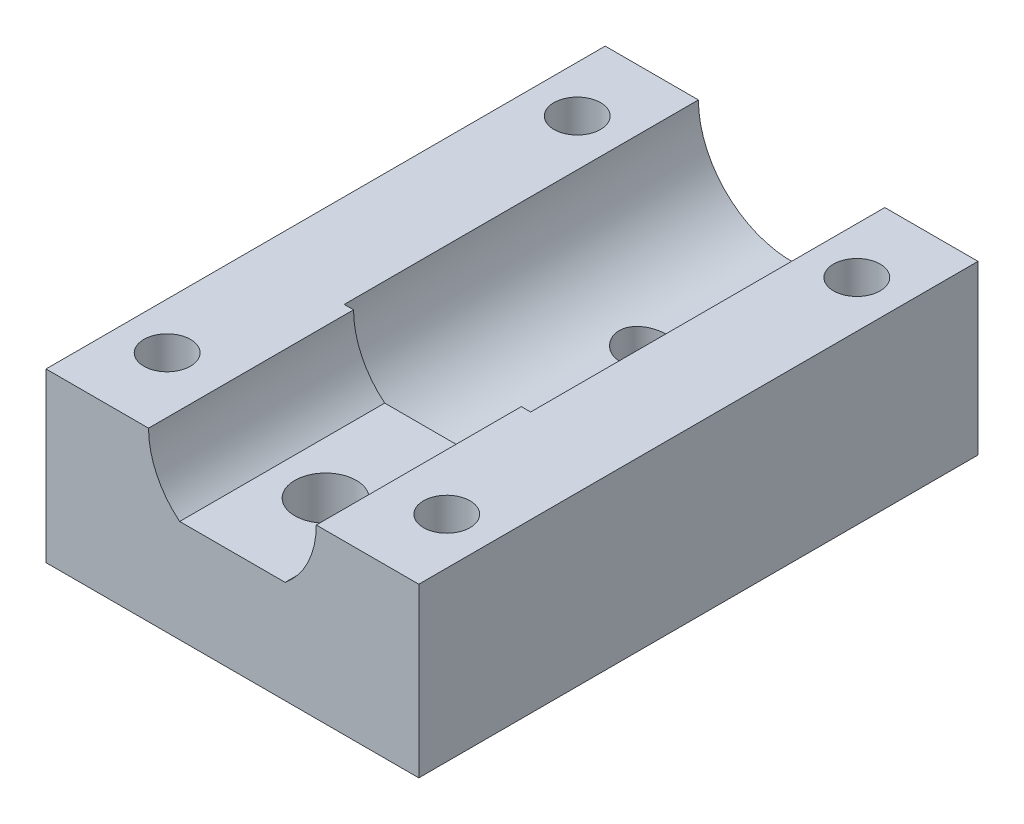
ISO-10303-21;
HEADER;
FILE_DESCRIPTION(('STEP AP214'),'2;1');
FILE_NAME('part.step','',(''),(''),'','','');
FILE_SCHEMA(('AUTOMOTIVE_DESIGN { 1 0 10303 214 1 1 1 1 }'));
ENDSEC;
DATA;
#1=APPLICATION_CONTEXT('core data for automotive mechanical design processes');
#2=APPLICATION_PROTOCOL_DEFINITION('international standard','automotive_design',2000,#1);
#3=PRODUCT_CONTEXT('',#1,'mechanical');
#4=PRODUCT('Part','Part','',(#3));
#5=PRODUCT_RELATED_PRODUCT_CATEGORY('part','',(#4));
#6=PRODUCT_DEFINITION_FORMATION('','',#4);
#7=PRODUCT_DEFINITION_CONTEXT('part definition',#1,'design');
#8=PRODUCT_DEFINITION('design','',#6,#7);
#9=PRODUCT_DEFINITION_SHAPE('','',#8);
#10=(LENGTH_UNIT() NAMED_UNIT(*) SI_UNIT(.MILLI.,.METRE.));
#11=(NAMED_UNIT(*) PLANE_ANGLE_UNIT() SI_UNIT($,.RADIAN.));
#12=(NAMED_UNIT(*) SI_UNIT($,.STERADIAN.) SOLID_ANGLE_UNIT());
#13=UNCERTAINTY_MEASURE_WITH_UNIT(LENGTH_MEASURE(1.E-05),#10,'distance_accuracy_value','');
#14=(GEOMETRIC_REPRESENTATION_CONTEXT(3) GLOBAL_UNCERTAINTY_ASSIGNED_CONTEXT((#13)) GLOBAL_UNIT_ASSIGNED_CONTEXT((#10,
#11,#12)) REPRESENTATION_CONTEXT('',''));
#15=CARTESIAN_POINT('',(0.,0.,0.));
#16=DIRECTION('',(0.,0.,1.));
#17=DIRECTION('',(1.,0.,0.));
#18=AXIS2_PLACEMENT_3D('',#15,#16,#17);
#19=CARTESIAN_POINT('',(0.,9.,4.));
#20=DIRECTION('',(0.,0.,-1.));
#21=DIRECTION('',(-1.,0.,0.));
#22=AXIS2_PLACEMENT_3D('',#19,#20,#21);
#23=PLANE('',#22);
#24=CARTESIAN_POINT('',(0.,9.,4.));
#25=DIRECTION('',(0.,0.,1.));
#26=DIRECTION('',(1.,0.,0.));
#27=AXIS2_PLACEMENT_3D('',#24,#25,#26);
#28=CIRCLE('',#27,4.5);
#29=CARTESIAN_POINT('',(2.82842712474619,5.5,4.));
#30=VERTEX_POINT('',#29);
#31=CARTESIAN_POINT('',(4.5,9.,4.));
#32=VERTEX_POINT('',#31);
#33=EDGE_CURVE('E94',#30,#32,#28,.T.);
#34=ORIENTED_EDGE('',*,*,#33,.T.);
#35=DIRECTION('',(-1.,0.,0.));
#36=VECTOR('',#35,1.);
#37=CARTESIAN_POINT('',(0.,9.,4.));
#38=LINE('',#37,#36);
#39=CARTESIAN_POINT('',(5.,9.,4.));
#40=VERTEX_POINT('',#39);
#41=EDGE_CURVE('E90',#32,#40,#38,.F.);
#42=ORIENTED_EDGE('',*,*,#41,.T.);
#43=CARTESIAN_POINT('',(0.,9.,4.));
#44=DIRECTION('',(0.,0.,-1.));
#45=DIRECTION('',(-1.,0.,0.));
#46=AXIS2_PLACEMENT_3D('',#43,#44,#45);
#47=CIRCLE('',#46,5.);
#48=CARTESIAN_POINT('',(-5.,9.,4.));
#49=VERTEX_POINT('',#48);
#50=EDGE_CURVE('E19',#40,#49,#47,.T.);
#51=ORIENTED_EDGE('',*,*,#50,.T.);
#52=DIRECTION('',(1.,0.,0.));
#53=VECTOR('',#52,1.);
#54=CARTESIAN_POINT('',(0.,9.,4.));
#55=LINE('',#54,#53);
#56=CARTESIAN_POINT('',(-4.49999999999999,9.,4.));
#57=VERTEX_POINT('',#56);
#58=EDGE_CURVE('E131',#57,#49,#55,.F.);
#59=ORIENTED_EDGE('',*,*,#58,.F.);
#60=CARTESIAN_POINT('',(0.,9.,4.));
#61=DIRECTION('',(0.,0.,1.));
#62=DIRECTION('',(1.,0.,0.));
#63=AXIS2_PLACEMENT_3D('',#60,#61,#62);
#64=CIRCLE('',#63,4.5);
#65=CARTESIAN_POINT('',(-2.82842712474618,5.5,4.));
#66=VERTEX_POINT('',#65);
#67=EDGE_CURVE('E277',#57,#66,#64,.T.);
#68=ORIENTED_EDGE('',*,*,#67,.T.);
#69=DIRECTION('',(1.,0.,0.));
#70=VECTOR('',#69,1.);
#71=CARTESIAN_POINT('',(-2.82842712474618,5.5,4.));
#72=LINE('',#71,#70);
#73=EDGE_CURVE('E128',#66,#30,#72,.T.);
#74=ORIENTED_EDGE('',*,*,#73,.T.);
#75=EDGE_LOOP('',(#34,#42,#51,#59,#68,#74));
#76=FACE_BOUND('',#75,.T.);
#77=ADVANCED_FACE('F16',(#76),#23,.T.);
#78=CARTESIAN_POINT('',(0.,9.,4.));
#79=DIRECTION('',(0.,0.,-1.));
#80=DIRECTION('',(-1.,0.,0.));
#81=AXIS2_PLACEMENT_3D('',#78,#79,#80);
#82=CYLINDRICAL_SURFACE('',#81,5.);
#83=CARTESIAN_POINT('',(0.,9.,-15.));
#84=DIRECTION('',(0.,0.,-1.));
#85=DIRECTION('',(-1.,0.,0.));
#86=AXIS2_PLACEMENT_3D('',#83,#84,#85);
#87=CIRCLE('',#86,5.);
#88=CARTESIAN_POINT('',(5.,9.,-15.));
#89=VERTEX_POINT('',#88);
#90=CARTESIAN_POINT('',(-5.,9.,-15.));
#91=VERTEX_POINT('',#90);
#92=EDGE_CURVE('E161',#89,#91,#87,.T.);
#93=ORIENTED_EDGE('',*,*,#92,.T.);
#94=DIRECTION('',(0.,0.,1.));
#95=VECTOR('',#94,1.);
#96=CARTESIAN_POINT('',(-5.,9.,0.));
#97=LINE('',#96,#95);
#98=EDGE_CURVE('E106',#49,#91,#97,.F.);
#99=ORIENTED_EDGE('',*,*,#98,.F.);
#100=ORIENTED_EDGE('',*,*,#50,.F.);
#101=DIRECTION('',(0.,0.,1.));
#102=VECTOR('',#101,1.);
#103=CARTESIAN_POINT('',(5.,9.,0.));
#104=LINE('',#103,#102);
#105=EDGE_CURVE('E104',#89,#40,#104,.T.);
#106=ORIENTED_EDGE('',*,*,#105,.F.);
#107=EDGE_LOOP('',(#93,#99,#100,#106));
#108=FACE_BOUND('',#107,.T.);
#109=CARTESIAN_POINT('',(0.,4.,-8.25));
#110=CARTESIAN_POINT('',(0.0689834338709208,4.00000204798545,-8.24999647194325));
#111=CARTESIAN_POINT('',(0.138047991225595,4.00144347881916,-8.24426425139458));
#112=CARTESIAN_POINT('',(0.274259227628062,4.00705999539577,-8.22150191857624));
#113=CARTESIAN_POINT('',(0.34140204701685,4.0112402277747,-8.20445053503297));
#114=CARTESIAN_POINT('',(0.471691196970988,4.02187061917282,-8.15963055459676));
#115=CARTESIAN_POINT('',(0.534844162944606,4.02831688576164,-8.13188032754713));
#116=CARTESIAN_POINT('',(0.655577636466275,4.0427911349397,-8.06650452013326));
#117=CARTESIAN_POINT('',(0.713159579330245,4.05081870849487,-8.02888149271595));
#118=CARTESIAN_POINT('',(0.822333235405505,4.06777132205219,-7.94400051621227));
#119=CARTESIAN_POINT('',(0.873793530738656,4.07671028349455,-7.8965762941011));
#120=CARTESIAN_POINT('',(0.968121801588268,4.09438601809419,-7.7937928693855));
#121=CARTESIAN_POINT('',(1.01098833563621,4.1031227571148,-7.73843233825626));
#122=CARTESIAN_POINT('',(1.0875222570665,4.11954356865302,-7.62033707733014));
#123=CARTESIAN_POINT('',(1.12104377078917,4.1272101058179,-7.55750515110713));
#124=CARTESIAN_POINT('',(1.17699760180892,4.14042091971882,-7.42687579676288));
#125=CARTESIAN_POINT('',(1.19943177787608,4.14596555215277,-7.35907920314792));
#126=CARTESIAN_POINT('',(1.23212901989295,4.15416269151965,-7.22188045975731));
#127=CARTESIAN_POINT('',(1.24262687762615,4.15687090441324,-7.1525376712656));
#128=CARTESIAN_POINT('',(1.25188481392645,4.15925531251216,-7.01302627781249));
#129=CARTESIAN_POINT('',(1.25064678787123,4.15893199731774,-6.94285780802908));
#130=CARTESIAN_POINT('',(1.23665546120039,4.15533996008313,-6.8054870505605));
#131=CARTESIAN_POINT('',(1.22418203710856,4.15214282949508,-6.7382540927512));
#132=CARTESIAN_POINT('',(1.18852030453296,4.14327745686829,-6.60686621539994));
#133=CARTESIAN_POINT('',(1.16533116214541,4.13760902251311,-6.54271153584047));
#134=CARTESIAN_POINT('',(1.10865696063818,4.12437382751996,-6.41854956242071));
#135=CARTESIAN_POINT('',(1.07507003355309,4.11678842760246,-6.35859083717551));
#136=CARTESIAN_POINT('',(0.998627282984115,4.1005851642059,-6.24506413393878));
#137=CARTESIAN_POINT('',(0.955770457681246,4.09196718917904,-6.19149684765622));
#138=CARTESIAN_POINT('',(0.860562745634029,4.07436944172048,-6.09067387624636));
#139=CARTESIAN_POINT('',(0.807977191233099,4.06538633800325,-6.04364012003066));
#140=CARTESIAN_POINT('',(0.69553293595429,4.04828687735162,-5.95899729468188));
#141=CARTESIAN_POINT('',(0.635671122740889,4.04017089412669,-5.92139227979678));
#142=CARTESIAN_POINT('',(0.510040153665741,4.02567862719116,-5.85659381898329));
#143=CARTESIAN_POINT('',(0.44424729782811,4.01930977502235,-5.82944465603989));
#144=CARTESIAN_POINT('',(0.308916989531656,4.00909337928535,-5.78670475741648));
#145=CARTESIAN_POINT('',(0.239387663549842,4.00524058600856,-5.77108994654218));
#146=CARTESIAN_POINT('',(0.141071644633927,4.00191112173497,-5.75766289925285));
#147=CARTESIAN_POINT('',(0.112942901376642,4.00119621555049,-5.75479208950472));
#148=CARTESIAN_POINT('',(0.0565473170387639,4.00024023432481,-5.75095991443283));
#149=CARTESIAN_POINT('',(0.0282804756308915,3.99999916040708,-5.74999855363647));
#150=CARTESIAN_POINT('',(-0.068983433870907,4.00000204798544,-5.75000352805674));
#151=CARTESIAN_POINT('',(-0.138047991225581,4.00144347881916,-5.75573574860542));
#152=CARTESIAN_POINT('',(-0.274259227628048,4.00705999539577,-5.77849808142376));
#153=CARTESIAN_POINT('',(-0.341402047016837,4.0112402277747,-5.79554946496703));
#154=CARTESIAN_POINT('',(-0.471691196970976,4.02187061917282,-5.84036944540324));
#155=CARTESIAN_POINT('',(-0.534844162944594,4.02831688576164,-5.86811967245287));
#156=CARTESIAN_POINT('',(-0.655577636466262,4.0427911349397,-5.93349547986674));
#157=CARTESIAN_POINT('',(-0.713159579330233,4.05081870849487,-5.97111850728405));
#158=CARTESIAN_POINT('',(-0.822333235405493,4.06777132205219,-6.05599948378773));
#159=CARTESIAN_POINT('',(-0.873793530738643,4.07671028349455,-6.1034237058989));
#160=CARTESIAN_POINT('',(-0.968121801588255,4.09438601809419,-6.20620713061451));
#161=CARTESIAN_POINT('',(-1.0109883356362,4.1031227571148,-6.26156766174374));
#162=CARTESIAN_POINT('',(-1.08752225706648,4.11954356865302,-6.37966292266986));
#163=CARTESIAN_POINT('',(-1.12104377078916,4.1272101058179,-6.44249484889287));
#164=CARTESIAN_POINT('',(-1.17699760180891,4.14042091971882,-6.57312420323712));
#165=CARTESIAN_POINT('',(-1.19943177787606,4.14596555215277,-6.64092079685209));
#166=CARTESIAN_POINT('',(-1.23212901989294,4.15416269151965,-6.77811954024269));
#167=CARTESIAN_POINT('',(-1.24262687762614,4.15687090441324,-6.8474623287344));
#168=CARTESIAN_POINT('',(-1.25188481392644,4.15925531251216,-6.98697372218751));
#169=CARTESIAN_POINT('',(-1.25064678787122,4.15893199731774,-7.05714219197092));
#170=CARTESIAN_POINT('',(-1.23665546120038,4.15533996008313,-7.1945129494395));
#171=CARTESIAN_POINT('',(-1.22418203710855,4.15214282949508,-7.26174590724881));
#172=CARTESIAN_POINT('',(-1.18852030453295,4.14327745686829,-7.39313378460006));
#173=CARTESIAN_POINT('',(-1.1653311621454,4.13760902251311,-7.45728846415953));
#174=CARTESIAN_POINT('',(-1.10865696063817,4.12437382751996,-7.5814504375793));
#175=CARTESIAN_POINT('',(-1.07507003355308,4.11678842760245,-7.64140916282449));
#176=CARTESIAN_POINT('',(-0.998627282984106,4.1005851642059,-7.75493586606122));
#177=CARTESIAN_POINT('',(-0.955770457681237,4.09196718917904,-7.80850315234379));
#178=CARTESIAN_POINT('',(-0.86056274563402,4.07436944172048,-7.90932612375365));
#179=CARTESIAN_POINT('',(-0.807977191233089,4.06538633800325,-7.95635987996935));
#180=CARTESIAN_POINT('',(-0.69553293595428,4.04828687735162,-8.04100270531812));
#181=CARTESIAN_POINT('',(-0.63567112274088,4.04017089412669,-8.07860772020323));
#182=CARTESIAN_POINT('',(-0.510040153665731,4.02567862719116,-8.14340618101672));
#183=CARTESIAN_POINT('',(-0.444247297828101,4.01930977502235,-8.17055534396012));
#184=CARTESIAN_POINT('',(-0.308916989531647,4.00909337928535,-8.21329524258352));
#185=CARTESIAN_POINT('',(-0.239387663549833,4.00524058600856,-8.22891005345782));
#186=CARTESIAN_POINT('',(-0.141071644633917,4.00191112173497,-8.24233710074716));
#187=CARTESIAN_POINT('',(-0.112942901376632,4.00119621555049,-8.24520791049529));
#188=CARTESIAN_POINT('',(-0.0565473170387523,4.00024023432481,-8.24904008556717));
#189=CARTESIAN_POINT('',(-0.028280475630879,3.99999916040708,-8.25000144636353));
#190=CARTESIAN_POINT('',(0.,4.,-8.25));
#191=B_SPLINE_CURVE_WITH_KNOTS('',3,(#109,#110,#111,#112,#113,#114,#115,#116,#117,#118,#119,
#120,#121,#122,#123,#124,#125,#126,#127,#128,#129,#130,#131,#132,#133,#134,#135,#136,#137,#138,
#139,#140,#141,#142,#143,#144,#145,#146,#147,#148,#149,#150,#151,#152,#153,#154,#155,#156,#157,
#158,#159,#160,#161,#162,#163,#164,#165,#166,#167,#168,#169,#170,#171,#172,#173,#174,#175,#176,
#177,#178,#179,#180,#181,#182,#183,#184,#185,#186,#187,#188,#189,#190),.UNSPECIFIED.,.T.,.F.,(4,
2,2,2,2,2,2,2,2,2,2,2,2,2,2,2,2,2,2,2,2,2,2,2,2,2,2,2,2,2,2,2,2,2,2,2,2,2,2,2,4),(0.,
0.206841864403401,0.414073536125849,0.620950965762521,0.827774952856966,1.0384478638904,
1.24915608248543,1.46298956127157,1.67678717912991,1.88630233474221,2.09578365365381,
2.30018680458587,2.50460586497612,2.71109464875447,2.91760575940505,3.1299701740738,
3.34242574694841,3.55577147527313,3.76867062742403,3.85346739829882,3.93826437023056,
4.14510623463396,4.35233790635641,4.55921533599308,4.76603932308753,4.97671223412096,
5.18742045271599,5.40125393150213,5.61505154936047,5.82456670497277,6.03404802388437,
6.23845117481644,6.44287023520668,6.64935901898503,6.85587012963561,7.06823454430436,
7.28069011717898,7.49403584550369,7.70693499765459,7.79173176852938,7.87652874046113),.UNSPECIFIED.);
#192=CARTESIAN_POINT('',(0.,4.,-8.25));
#193=VERTEX_POINT('',#192);
#194=EDGE_CURVE('E167',#193,#193,#191,.T.);
#195=ORIENTED_EDGE('',*,*,#194,.T.);
#196=EDGE_LOOP('',(#195));
#197=FACE_BOUND('',#196,.T.);
#198=ADVANCED_FACE('F102',(#108,#197),#82,.F.);
#199=CARTESIAN_POINT('',(0.,9.,0.));
#200=DIRECTION('',(0.,1.,0.));
#201=DIRECTION('',(0.,0.,1.));
#202=AXIS2_PLACEMENT_3D('',#199,#200,#201);
#203=PLANE('',#202);
#204=DIRECTION('',(0.,0.,1.));
#205=VECTOR('',#204,1.);
#206=CARTESIAN_POINT('',(-4.49999999999999,9.,4.));
#207=LINE('',#206,#205);
#208=CARTESIAN_POINT('',(-4.49999999999999,9.,15.));
#209=VERTEX_POINT('',#208);
#210=EDGE_CURVE('E133',#209,#57,#207,.F.);
#211=ORIENTED_EDGE('',*,*,#210,.T.);
#212=ORIENTED_EDGE('',*,*,#58,.T.);
#213=ORIENTED_EDGE('',*,*,#98,.T.);
#214=DIRECTION('',(1.,0.,0.));
#215=VECTOR('',#214,1.);
#216=CARTESIAN_POINT('',(-10.,9.,-15.));
#217=LINE('',#216,#215);
#218=CARTESIAN_POINT('',(-10.,9.,-15.));
#219=VERTEX_POINT('',#218);
#220=EDGE_CURVE('E163',#91,#219,#217,.F.);
#221=ORIENTED_EDGE('',*,*,#220,.T.);
#222=DIRECTION('',(0.,0.,-1.));
#223=VECTOR('',#222,1.);
#224=CARTESIAN_POINT('',(-10.,9.,-15.));
#225=LINE('',#224,#223);
#226=CARTESIAN_POINT('',(-9.99999999999999,9.,15.));
#227=VERTEX_POINT('',#226);
#228=EDGE_CURVE('E256',#219,#227,#225,.F.);
#229=ORIENTED_EDGE('',*,*,#228,.T.);
#230=DIRECTION('',(-1.,0.,0.));
#231=VECTOR('',#230,1.);
#232=CARTESIAN_POINT('',(-9.99999999999999,9.,15.));
#233=LINE('',#232,#231);
#234=EDGE_CURVE('E160',#227,#209,#233,.F.);
#235=ORIENTED_EDGE('',*,*,#234,.T.);
#236=EDGE_LOOP('',(#211,#212,#213,#221,#229,#235));
#237=FACE_BOUND('',#236,.T.);
#238=CARTESIAN_POINT('',(-7.5,8.99999999999999,-11.));
#239=DIRECTION('',(0.,-1.,0.));
#240=DIRECTION('',(0.,0.,-1.));
#241=AXIS2_PLACEMENT_3D('',#238,#239,#240);
#242=CIRCLE('',#241,1.24999999999999);
#243=CARTESIAN_POINT('',(-7.5,8.99999999999999,-12.25));
#244=VERTEX_POINT('',#243);
#245=EDGE_CURVE('E173',#244,#244,#242,.T.);
#246=ORIENTED_EDGE('',*,*,#245,.T.);
#247=EDGE_LOOP('',(#246));
#248=FACE_BOUND('',#247,.T.);
#249=CARTESIAN_POINT('',(-7.5,8.99999999999999,11.));
#250=DIRECTION('',(0.,-1.,0.));
#251=DIRECTION('',(0.,0.,-1.));
#252=AXIS2_PLACEMENT_3D('',#249,#250,#251);
#253=CIRCLE('',#252,1.24999999999999);
#254=CARTESIAN_POINT('',(-7.5,8.99999999999999,9.75000000000001));
#255=VERTEX_POINT('',#254);
#256=EDGE_CURVE('E114',#255,#255,#253,.T.);
#257=ORIENTED_EDGE('',*,*,#256,.T.);
#258=EDGE_LOOP('',(#257));
#259=FACE_BOUND('',#258,.T.);
#260=ADVANCED_FACE('F213',(#237,#248,#259),#203,.T.);
#261=CARTESIAN_POINT('',(0.,9.,4.));
#262=DIRECTION('',(0.,0.,1.));
#263=DIRECTION('',(1.,0.,0.));
#264=AXIS2_PLACEMENT_3D('',#261,#262,#263);
#265=CYLINDRICAL_SURFACE('',#264,4.5);
#266=DIRECTION('',(0.,0.,-1.));
#267=VECTOR('',#266,1.);
#268=CARTESIAN_POINT('',(-2.82842712474618,5.5,4.));
#269=LINE('',#268,#267);
#270=CARTESIAN_POINT('',(-2.82842712474618,5.5,15.));
#271=VERTEX_POINT('',#270);
#272=EDGE_CURVE('E130',#271,#66,#269,.T.);
#273=ORIENTED_EDGE('',*,*,#272,.T.);
#274=ORIENTED_EDGE('',*,*,#67,.F.);
#275=ORIENTED_EDGE('',*,*,#210,.F.);
#276=CARTESIAN_POINT('',(0.,9.,15.));
#277=DIRECTION('',(0.,0.,1.));
#278=DIRECTION('',(1.,0.,0.));
#279=AXIS2_PLACEMENT_3D('',#276,#277,#278);
#280=CIRCLE('',#279,4.5);
#281=EDGE_CURVE('E157',#209,#271,#280,.T.);
#282=ORIENTED_EDGE('',*,*,#281,.T.);
#283=EDGE_LOOP('',(#273,#274,#275,#282));
#284=FACE_BOUND('',#283,.T.);
#285=ADVANCED_FACE('F210',(#284),#265,.F.);
#286=CARTESIAN_POINT('',(-2.82842712474618,5.5,4.));
#287=DIRECTION('',(0.,-1.,0.));
#288=DIRECTION('',(0.,0.,-1.));
#289=AXIS2_PLACEMENT_3D('',#286,#287,#288);
#290=PLANE('',#289);
#291=DIRECTION('',(0.,0.,1.));
#292=VECTOR('',#291,1.);
#293=CARTESIAN_POINT('',(2.82842712474619,5.5,4.));
#294=LINE('',#293,#292);
#295=CARTESIAN_POINT('',(2.82842712474619,5.5,15.));
#296=VERTEX_POINT('',#295);
#297=EDGE_CURVE('E116',#296,#30,#294,.F.);
#298=ORIENTED_EDGE('',*,*,#297,.T.);
#299=ORIENTED_EDGE('',*,*,#73,.F.);
#300=ORIENTED_EDGE('',*,*,#272,.F.);
#301=DIRECTION('',(-1.,0.,0.));
#302=VECTOR('',#301,1.);
#303=CARTESIAN_POINT('',(-9.99999999999999,5.5,15.));
#304=LINE('',#303,#302);
#305=EDGE_CURVE('E156',#271,#296,#304,.F.);
#306=ORIENTED_EDGE('',*,*,#305,.T.);
#307=EDGE_LOOP('',(#298,#299,#300,#306));
#308=FACE_BOUND('',#307,.T.);
#309=CARTESIAN_POINT('',(0.,5.5,10.));
#310=DIRECTION('',(0.,-1.,0.));
#311=DIRECTION('',(0.,0.,-1.));
#312=AXIS2_PLACEMENT_3D('',#309,#310,#311);
#313=CIRCLE('',#312,1.64999999999999);
#314=CARTESIAN_POINT('',(0.,5.5,8.35000000000001));
#315=VERTEX_POINT('',#314);
#316=EDGE_CURVE('E164',#315,#315,#313,.T.);
#317=ORIENTED_EDGE('',*,*,#316,.T.);
#318=EDGE_LOOP('',(#317));
#319=FACE_BOUND('',#318,.T.);
#320=ADVANCED_FACE('F206',(#308,#319),#290,.F.);
#321=CARTESIAN_POINT('',(0.,9.,4.));
#322=DIRECTION('',(0.,0.,1.));
#323=DIRECTION('',(1.,0.,0.));
#324=AXIS2_PLACEMENT_3D('',#321,#322,#323);
#325=CYLINDRICAL_SURFACE('',#324,4.5);
#326=DIRECTION('',(0.,0.,1.));
#327=VECTOR('',#326,1.);
#328=CARTESIAN_POINT('',(4.5,9.,0.));
#329=LINE('',#328,#327);
#330=CARTESIAN_POINT('',(4.5,9.,15.));
#331=VERTEX_POINT('',#330);
#332=EDGE_CURVE('E112',#32,#331,#329,.T.);
#333=ORIENTED_EDGE('',*,*,#332,.F.);
#334=ORIENTED_EDGE('',*,*,#33,.F.);
#335=ORIENTED_EDGE('',*,*,#297,.F.);
#336=CARTESIAN_POINT('',(0.,9.,15.));
#337=DIRECTION('',(0.,0.,1.));
#338=DIRECTION('',(1.,0.,0.));
#339=AXIS2_PLACEMENT_3D('',#336,#337,#338);
#340=CIRCLE('',#339,4.5);
#341=EDGE_CURVE('E152',#296,#331,#340,.T.);
#342=ORIENTED_EDGE('',*,*,#341,.T.);
#343=EDGE_LOOP('',(#333,#334,#335,#342));
#344=FACE_BOUND('',#343,.T.);
#345=ADVANCED_FACE('F203',(#344),#325,.F.);
#346=CARTESIAN_POINT('',(0.,9.,0.));
#347=DIRECTION('',(0.,1.,0.));
#348=DIRECTION('',(0.,0.,1.));
#349=AXIS2_PLACEMENT_3D('',#346,#347,#348);
#350=PLANE('',#349);
#351=DIRECTION('',(0.,0.,1.));
#352=VECTOR('',#351,1.);
#353=CARTESIAN_POINT('',(10.,9.,-15.));
#354=LINE('',#353,#352);
#355=CARTESIAN_POINT('',(10.,9.,15.));
#356=VERTEX_POINT('',#355);
#357=CARTESIAN_POINT('',(10.,9.,-15.));
#358=VERTEX_POINT('',#357);
#359=EDGE_CURVE('E125',#356,#358,#354,.F.);
#360=ORIENTED_EDGE('',*,*,#359,.T.);
#361=DIRECTION('',(1.,0.,0.));
#362=VECTOR('',#361,1.);
#363=CARTESIAN_POINT('',(-10.,9.,-15.));
#364=LINE('',#363,#362);
#365=EDGE_CURVE('E111',#358,#89,#364,.F.);
#366=ORIENTED_EDGE('',*,*,#365,.T.);
#367=ORIENTED_EDGE('',*,*,#105,.T.);
#368=ORIENTED_EDGE('',*,*,#41,.F.);
#369=ORIENTED_EDGE('',*,*,#332,.T.);
#370=DIRECTION('',(-1.,0.,0.));
#371=VECTOR('',#370,1.);
#372=CARTESIAN_POINT('',(-9.99999999999999,9.,15.));
#373=LINE('',#372,#371);
#374=EDGE_CURVE('E155',#331,#356,#373,.F.);
#375=ORIENTED_EDGE('',*,*,#374,.T.);
#376=EDGE_LOOP('',(#360,#366,#367,#368,#369,#375));
#377=FACE_BOUND('',#376,.T.);
#378=CARTESIAN_POINT('',(7.5,8.99999999999999,-11.));
#379=DIRECTION('',(0.,-1.,0.));
#380=DIRECTION('',(0.,0.,-1.));
#381=AXIS2_PLACEMENT_3D('',#378,#379,#380);
#382=CIRCLE('',#381,1.24999999999999);
#383=CARTESIAN_POINT('',(7.5,8.99999999999999,-12.25));
#384=VERTEX_POINT('',#383);
#385=EDGE_CURVE('E319',#384,#384,#382,.T.);
#386=ORIENTED_EDGE('',*,*,#385,.T.);
#387=EDGE_LOOP('',(#386));
#388=FACE_BOUND('',#387,.T.);
#389=CARTESIAN_POINT('',(7.5,8.99999999999999,11.));
#390=DIRECTION('',(0.,-1.,0.));
#391=DIRECTION('',(0.,0.,-1.));
#392=AXIS2_PLACEMENT_3D('',#389,#390,#391);
#393=CIRCLE('',#392,1.24999999999999);
#394=CARTESIAN_POINT('',(7.5,8.99999999999999,9.75000000000001));
#395=VERTEX_POINT('',#394);
#396=EDGE_CURVE('E317',#395,#395,#393,.T.);
#397=ORIENTED_EDGE('',*,*,#396,.T.);
#398=EDGE_LOOP('',(#397));
#399=FACE_BOUND('',#398,.T.);
#400=ADVANCED_FACE('F109',(#377,#388,#399),#350,.T.);
#401=CARTESIAN_POINT('',(-7.5,0.,11.));
#402=DIRECTION('',(0.,-1.,0.));
#403=DIRECTION('',(0.,0.,-1.));
#404=AXIS2_PLACEMENT_3D('',#401,#402,#403);
#405=CYLINDRICAL_SURFACE('',#404,1.24999999999999);
#406=ORIENTED_EDGE('',*,*,#256,.F.);
#407=EDGE_LOOP('',(#406));
#408=FACE_BOUND('',#407,.T.);
#409=CARTESIAN_POINT('',(-7.5,0.,11.));
#410=DIRECTION('',(0.,-1.,0.));
#411=DIRECTION('',(0.,0.,-1.));
#412=AXIS2_PLACEMENT_3D('',#409,#410,#411);
#413=CIRCLE('',#412,1.24999999999999);
#414=CARTESIAN_POINT('',(-7.5,0.,9.75000000000001));
#415=VERTEX_POINT('',#414);
#416=EDGE_CURVE('E124',#415,#415,#413,.T.);
#417=ORIENTED_EDGE('',*,*,#416,.T.);
#418=EDGE_LOOP('',(#417));
#419=FACE_BOUND('',#418,.T.);
#420=ADVANCED_FACE('F196',(#408,#419),#405,.F.);
#421=CARTESIAN_POINT('',(7.5,0.,11.));
#422=DIRECTION('',(0.,-1.,0.));
#423=DIRECTION('',(0.,0.,-1.));
#424=AXIS2_PLACEMENT_3D('',#421,#422,#423);
#425=CYLINDRICAL_SURFACE('',#424,1.24999999999999);
#426=ORIENTED_EDGE('',*,*,#396,.F.);
#427=EDGE_LOOP('',(#426));
#428=FACE_BOUND('',#427,.T.);
#429=CARTESIAN_POINT('',(7.5,0.,11.));
#430=DIRECTION('',(0.,-1.,0.));
#431=DIRECTION('',(0.,0.,-1.));
#432=AXIS2_PLACEMENT_3D('',#429,#430,#431);
#433=CIRCLE('',#432,1.24999999999999);
#434=CARTESIAN_POINT('',(7.5,0.,9.75000000000001));
#435=VERTEX_POINT('',#434);
#436=EDGE_CURVE('E147',#435,#435,#433,.T.);
#437=ORIENTED_EDGE('',*,*,#436,.T.);
#438=EDGE_LOOP('',(#437));
#439=FACE_BOUND('',#438,.T.);
#440=ADVANCED_FACE('F192',(#428,#439),#425,.F.);
#441=CARTESIAN_POINT('',(7.5,0.,-11.));
#442=DIRECTION('',(0.,-1.,0.));
#443=DIRECTION('',(0.,0.,-1.));
#444=AXIS2_PLACEMENT_3D('',#441,#442,#443);
#445=CYLINDRICAL_SURFACE('',#444,1.24999999999999);
#446=ORIENTED_EDGE('',*,*,#385,.F.);
#447=EDGE_LOOP('',(#446));
#448=FACE_BOUND('',#447,.T.);
#449=CARTESIAN_POINT('',(7.5,0.,-11.));
#450=DIRECTION('',(0.,-1.,0.));
#451=DIRECTION('',(0.,0.,-1.));
#452=AXIS2_PLACEMENT_3D('',#449,#450,#451);
#453=CIRCLE('',#452,1.24999999999999);
#454=CARTESIAN_POINT('',(7.5,0.,-12.25));
#455=VERTEX_POINT('',#454);
#456=EDGE_CURVE('E144',#455,#455,#453,.T.);
#457=ORIENTED_EDGE('',*,*,#456,.T.);
#458=EDGE_LOOP('',(#457));
#459=FACE_BOUND('',#458,.T.);
#460=ADVANCED_FACE('F188',(#448,#459),#445,.F.);
#461=CARTESIAN_POINT('',(-7.5,0.,-11.));
#462=DIRECTION('',(0.,-1.,0.));
#463=DIRECTION('',(0.,0.,-1.));
#464=AXIS2_PLACEMENT_3D('',#461,#462,#463);
#465=CYLINDRICAL_SURFACE('',#464,1.24999999999999);
#466=ORIENTED_EDGE('',*,*,#245,.F.);
#467=EDGE_LOOP('',(#466));
#468=FACE_BOUND('',#467,.T.);
#469=CARTESIAN_POINT('',(-7.5,0.,-11.));
#470=DIRECTION('',(0.,-1.,0.));
#471=DIRECTION('',(0.,0.,-1.));
#472=AXIS2_PLACEMENT_3D('',#469,#470,#471);
#473=CIRCLE('',#472,1.24999999999999);
#474=CARTESIAN_POINT('',(-7.5,0.,-12.25));
#475=VERTEX_POINT('',#474);
#476=EDGE_CURVE('E141',#475,#475,#473,.T.);
#477=ORIENTED_EDGE('',*,*,#476,.T.);
#478=EDGE_LOOP('',(#477));
#479=FACE_BOUND('',#478,.T.);
#480=ADVANCED_FACE('F183',(#468,#479),#465,.F.);
#481=CARTESIAN_POINT('',(0.,0.,-7.));
#482=DIRECTION('',(0.,-1.,0.));
#483=DIRECTION('',(0.,0.,-1.));
#484=AXIS2_PLACEMENT_3D('',#481,#482,#483);
#485=CYLINDRICAL_SURFACE('',#484,1.25);
#486=ORIENTED_EDGE('',*,*,#194,.F.);
#487=EDGE_LOOP('',(#486));
#488=FACE_BOUND('',#487,.T.);
#489=CARTESIAN_POINT('',(0.,0.,-7.));
#490=DIRECTION('',(0.,-1.,0.));
#491=DIRECTION('',(0.,0.,-1.));
#492=AXIS2_PLACEMENT_3D('',#489,#490,#491);
#493=CIRCLE('',#492,1.25);
#494=CARTESIAN_POINT('',(0.,0.,-8.25));
#495=VERTEX_POINT('',#494);
#496=EDGE_CURVE('E138',#495,#495,#493,.T.);
#497=ORIENTED_EDGE('',*,*,#496,.T.);
#498=EDGE_LOOP('',(#497));
#499=FACE_BOUND('',#498,.T.);
#500=ADVANCED_FACE('F177',(#488,#499),#485,.F.);
#501=CARTESIAN_POINT('',(0.,0.,10.));
#502=DIRECTION('',(0.,-1.,0.));
#503=DIRECTION('',(0.,0.,-1.));
#504=AXIS2_PLACEMENT_3D('',#501,#502,#503);
#505=CYLINDRICAL_SURFACE('',#504,1.64999999999999);
#506=ORIENTED_EDGE('',*,*,#316,.F.);
#507=EDGE_LOOP('',(#506));
#508=FACE_BOUND('',#507,.T.);
#509=CARTESIAN_POINT('',(0.,0.,10.));
#510=DIRECTION('',(0.,-1.,0.));
#511=DIRECTION('',(0.,0.,-1.));
#512=AXIS2_PLACEMENT_3D('',#509,#510,#511);
#513=CIRCLE('',#512,1.64999999999999);
#514=CARTESIAN_POINT('',(0.,0.,8.35000000000001));
#515=VERTEX_POINT('',#514);
#516=EDGE_CURVE('E134',#515,#515,#513,.T.);
#517=ORIENTED_EDGE('',*,*,#516,.T.);
#518=EDGE_LOOP('',(#517));
#519=FACE_BOUND('',#518,.T.);
#520=ADVANCED_FACE('F182',(#508,#519),#505,.F.);
#521=CARTESIAN_POINT('',(-10.,9.,-15.));
#522=DIRECTION('',(0.,0.,1.));
#523=DIRECTION('',(1.,0.,0.));
#524=AXIS2_PLACEMENT_3D('',#521,#522,#523);
#525=PLANE('',#524);
#526=ORIENTED_EDGE('',*,*,#92,.F.);
#527=ORIENTED_EDGE('',*,*,#365,.F.);
#528=DIRECTION('',(0.,1.,0.));
#529=VECTOR('',#528,1.);
#530=CARTESIAN_POINT('',(10.,9.,-15.));
#531=LINE('',#530,#529);
#532=CARTESIAN_POINT('',(10.,0.,-15.));
#533=VERTEX_POINT('',#532);
#534=EDGE_CURVE('E121',#358,#533,#531,.F.);
#535=ORIENTED_EDGE('',*,*,#534,.T.);
#536=DIRECTION('',(1.,0.,0.));
#537=VECTOR('',#536,1.);
#538=CARTESIAN_POINT('',(0.,0.,-15.));
#539=LINE('',#538,#537);
#540=CARTESIAN_POINT('',(-10.,0.,-15.));
#541=VERTEX_POINT('',#540);
#542=EDGE_CURVE('E137',#533,#541,#539,.F.);
#543=ORIENTED_EDGE('',*,*,#542,.T.);
#544=DIRECTION('',(0.,1.,0.));
#545=VECTOR('',#544,1.);
#546=CARTESIAN_POINT('',(-10.,9.,-15.));
#547=LINE('',#546,#545);
#548=EDGE_CURVE('E253',#541,#219,#547,.T.);
#549=ORIENTED_EDGE('',*,*,#548,.T.);
#550=ORIENTED_EDGE('',*,*,#220,.F.);
#551=EDGE_LOOP('',(#526,#527,#535,#543,#549,#550));
#552=FACE_BOUND('',#551,.T.);
#553=ADVANCED_FACE('F241',(#552),#525,.F.);
#554=CARTESIAN_POINT('',(-10.,9.,-15.));
#555=DIRECTION('',(1.,0.,0.));
#556=DIRECTION('',(0.,0.,-1.));
#557=AXIS2_PLACEMENT_3D('',#554,#555,#556);
#558=PLANE('',#557);
#559=DIRECTION('',(0.,1.,0.));
#560=VECTOR('',#559,1.);
#561=CARTESIAN_POINT('',(-9.99999999999999,9.,15.));
#562=LINE('',#561,#560);
#563=CARTESIAN_POINT('',(-9.99999999999999,0.,15.));
#564=VERTEX_POINT('',#563);
#565=EDGE_CURVE('E279',#564,#227,#562,.T.);
#566=ORIENTED_EDGE('',*,*,#565,.T.);
#567=ORIENTED_EDGE('',*,*,#228,.F.);
#568=ORIENTED_EDGE('',*,*,#548,.F.);
#569=DIRECTION('',(0.,0.,1.));
#570=VECTOR('',#569,1.);
#571=CARTESIAN_POINT('',(-10.,0.,0.));
#572=LINE('',#571,#570);
#573=EDGE_CURVE('E289',#541,#564,#572,.T.);
#574=ORIENTED_EDGE('',*,*,#573,.T.);
#575=EDGE_LOOP('',(#566,#567,#568,#574));
#576=FACE_BOUND('',#575,.T.);
#577=ADVANCED_FACE('F238',(#576),#558,.F.);
#578=CARTESIAN_POINT('',(-9.99999999999999,9.,15.));
#579=DIRECTION('',(0.,0.,-1.));
#580=DIRECTION('',(-1.,0.,0.));
#581=AXIS2_PLACEMENT_3D('',#578,#579,#580);
#582=PLANE('',#581);
#583=ORIENTED_EDGE('',*,*,#341,.F.);
#584=ORIENTED_EDGE('',*,*,#305,.F.);
#585=ORIENTED_EDGE('',*,*,#281,.F.);
#586=ORIENTED_EDGE('',*,*,#234,.F.);
#587=ORIENTED_EDGE('',*,*,#565,.F.);
#588=DIRECTION('',(1.,0.,0.));
#589=VECTOR('',#588,1.);
#590=CARTESIAN_POINT('',(0.,0.,15.));
#591=LINE('',#590,#589);
#592=CARTESIAN_POINT('',(10.,0.,15.));
#593=VERTEX_POINT('',#592);
#594=EDGE_CURVE('E25',#564,#593,#591,.T.);
#595=ORIENTED_EDGE('',*,*,#594,.T.);
#596=DIRECTION('',(0.,1.,0.));
#597=VECTOR('',#596,1.);
#598=CARTESIAN_POINT('',(10.,9.,15.));
#599=LINE('',#598,#597);
#600=EDGE_CURVE('E33',#593,#356,#599,.T.);
#601=ORIENTED_EDGE('',*,*,#600,.T.);
#602=ORIENTED_EDGE('',*,*,#374,.F.);
#603=EDGE_LOOP('',(#583,#584,#585,#586,#587,#595,#601,#602));
#604=FACE_BOUND('',#603,.T.);
#605=ADVANCED_FACE('F231',(#604),#582,.F.);
#606=CARTESIAN_POINT('',(10.,9.,-15.));
#607=DIRECTION('',(-1.,0.,0.));
#608=DIRECTION('',(0.,0.,1.));
#609=AXIS2_PLACEMENT_3D('',#606,#607,#608);
#610=PLANE('',#609);
#611=ORIENTED_EDGE('',*,*,#534,.F.);
#612=ORIENTED_EDGE('',*,*,#359,.F.);
#613=ORIENTED_EDGE('',*,*,#600,.F.);
#614=DIRECTION('',(0.,0.,1.));
#615=VECTOR('',#614,1.);
#616=CARTESIAN_POINT('',(10.,0.,0.));
#617=LINE('',#616,#615);
#618=EDGE_CURVE('E10',#593,#533,#617,.F.);
#619=ORIENTED_EDGE('',*,*,#618,.T.);
#620=EDGE_LOOP('',(#611,#612,#613,#619));
#621=FACE_BOUND('',#620,.T.);
#622=ADVANCED_FACE('F225',(#621),#610,.F.);
#623=CARTESIAN_POINT('',(0.,0.,0.));
#624=DIRECTION('',(0.,1.,0.));
#625=DIRECTION('',(0.,0.,1.));
#626=AXIS2_PLACEMENT_3D('',#623,#624,#625);
#627=PLANE('',#626);
#628=ORIENTED_EDGE('',*,*,#594,.F.);
#629=ORIENTED_EDGE('',*,*,#573,.F.);
#630=ORIENTED_EDGE('',*,*,#542,.F.);
#631=ORIENTED_EDGE('',*,*,#618,.F.);
#632=EDGE_LOOP('',(#628,#629,#630,#631));
#633=FACE_BOUND('',#632,.T.);
#634=ORIENTED_EDGE('',*,*,#516,.F.);
#635=EDGE_LOOP('',(#634));
#636=FACE_BOUND('',#635,.T.);
#637=ORIENTED_EDGE('',*,*,#496,.F.);
#638=EDGE_LOOP('',(#637));
#639=FACE_BOUND('',#638,.T.);
#640=ORIENTED_EDGE('',*,*,#476,.F.);
#641=EDGE_LOOP('',(#640));
#642=FACE_BOUND('',#641,.T.);
#643=ORIENTED_EDGE('',*,*,#456,.F.);
#644=EDGE_LOOP('',(#643));
#645=FACE_BOUND('',#644,.T.);
#646=ORIENTED_EDGE('',*,*,#436,.F.);
#647=EDGE_LOOP('',(#646));
#648=FACE_BOUND('',#647,.T.);
#649=ORIENTED_EDGE('',*,*,#416,.F.);
#650=EDGE_LOOP('',(#649));
#651=FACE_BOUND('',#650,.T.);
#652=ADVANCED_FACE('F223',(#633,#636,#639,#642,#645,#648,#651),#627,.F.);
#653=CLOSED_SHELL('',(#77,#198,#260,#285,#320,#345,#400,#420,#440,#460,#480,#500,#520,#553,#577,
#605,#622,#652));
#654=MANIFOLD_SOLID_BREP('B1',#653);
#655=ADVANCED_BREP_SHAPE_REPRESENTATION('',(#18,#654),#14);
#656=SHAPE_DEFINITION_REPRESENTATION(#9,#655);
ENDSEC;
END-ISO-10303-21;
